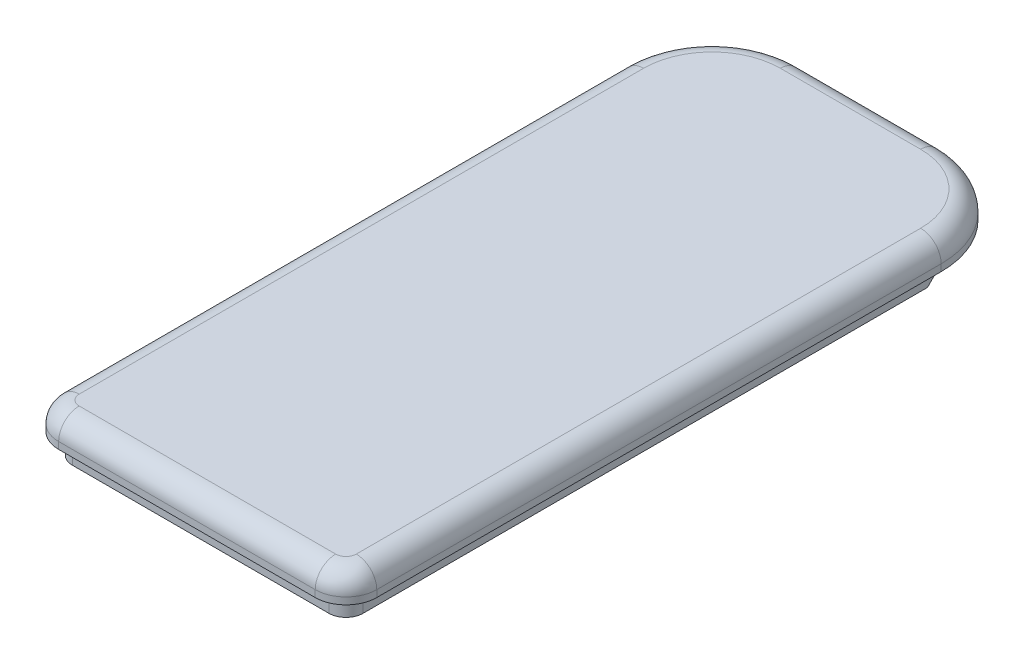
ISO-10303-21;
HEADER;
FILE_DESCRIPTION(('STEP AP214'),'2;1');
FILE_NAME('part.step','',(''),(''),'','','');
FILE_SCHEMA(('AUTOMOTIVE_DESIGN { 1 0 10303 214 1 1 1 1 }'));
ENDSEC;
DATA;
#1=APPLICATION_CONTEXT('core data for automotive mechanical design processes');
#2=APPLICATION_PROTOCOL_DEFINITION('international standard','automotive_design',2000,#1);
#3=PRODUCT_CONTEXT('',#1,'mechanical');
#4=PRODUCT('Part','Part','',(#3));
#5=PRODUCT_RELATED_PRODUCT_CATEGORY('part','',(#4));
#6=PRODUCT_DEFINITION_FORMATION('','',#4);
#7=PRODUCT_DEFINITION_CONTEXT('part definition',#1,'design');
#8=PRODUCT_DEFINITION('design','',#6,#7);
#9=PRODUCT_DEFINITION_SHAPE('','',#8);
#10=(LENGTH_UNIT() NAMED_UNIT(*) SI_UNIT(.MILLI.,.METRE.));
#11=(NAMED_UNIT(*) PLANE_ANGLE_UNIT() SI_UNIT($,.RADIAN.));
#12=(NAMED_UNIT(*) SI_UNIT($,.STERADIAN.) SOLID_ANGLE_UNIT());
#13=UNCERTAINTY_MEASURE_WITH_UNIT(LENGTH_MEASURE(1.E-05),#10,'distance_accuracy_value','');
#14=(GEOMETRIC_REPRESENTATION_CONTEXT(3) GLOBAL_UNCERTAINTY_ASSIGNED_CONTEXT((#13)) GLOBAL_UNIT_ASSIGNED_CONTEXT((#10,
#11,#12)) REPRESENTATION_CONTEXT('',''));
#15=CARTESIAN_POINT('',(0.,0.,0.));
#16=DIRECTION('',(0.,0.,1.));
#17=DIRECTION('',(1.,0.,0.));
#18=AXIS2_PLACEMENT_3D('',#15,#16,#17);
#19=CARTESIAN_POINT('',(4.5,-4.,-4.5));
#20=DIRECTION('',(0.,1.,0.));
#21=DIRECTION('',(0.,0.,1.));
#22=AXIS2_PLACEMENT_3D('',#19,#20,#21);
#23=PLANE('',#22);
#24=CARTESIAN_POINT('',(4.5,-4.,-4.5));
#25=DIRECTION('',(0.,1.,0.));
#26=DIRECTION('',(0.,0.,1.));
#27=AXIS2_PLACEMENT_3D('',#24,#25,#26);
#28=CIRCLE('',#27,4.5);
#29=CARTESIAN_POINT('',(0.,-4.,-4.50000000000003));
#30=VERTEX_POINT('',#29);
#31=CARTESIAN_POINT('',(4.50000000000003,-4.,0.));
#32=VERTEX_POINT('',#31);
#33=EDGE_CURVE('E321',#30,#32,#28,.T.);
#34=ORIENTED_EDGE('',*,*,#33,.F.);
#35=DIRECTION('',(0.,0.,1.));
#36=VECTOR('',#35,1.);
#37=CARTESIAN_POINT('',(0.,-4.,-4.50000000000003));
#38=LINE('',#37,#36);
#39=CARTESIAN_POINT('',(0.,-4.,-86.9999999999999));
#40=VERTEX_POINT('',#39);
#41=EDGE_CURVE('E354',#40,#30,#38,.T.);
#42=ORIENTED_EDGE('',*,*,#41,.F.);
#43=CARTESIAN_POINT('',(13.,-4.,-87.));
#44=DIRECTION('',(0.,1.,0.));
#45=DIRECTION('',(0.,0.,-1.));
#46=AXIS2_PLACEMENT_3D('',#43,#44,#45);
#47=CIRCLE('',#46,13.);
#48=CARTESIAN_POINT('',(13.0000000000001,-4.,-100.));
#49=VERTEX_POINT('',#48);
#50=EDGE_CURVE('E351',#49,#40,#47,.T.);
#51=ORIENTED_EDGE('',*,*,#50,.F.);
#52=DIRECTION('',(-1.,0.,0.));
#53=VECTOR('',#52,1.);
#54=CARTESIAN_POINT('',(13.0000000000001,-4.,-100.));
#55=LINE('',#54,#53);
#56=CARTESIAN_POINT('',(33.4999999999999,-4.,-100.));
#57=VERTEX_POINT('',#56);
#58=EDGE_CURVE('E348',#57,#49,#55,.T.);
#59=ORIENTED_EDGE('',*,*,#58,.F.);
#60=CARTESIAN_POINT('',(33.5,-4.,-87.));
#61=DIRECTION('',(0.,1.,0.));
#62=DIRECTION('',(0.,0.,-1.));
#63=AXIS2_PLACEMENT_3D('',#60,#61,#62);
#64=CIRCLE('',#63,13.);
#65=CARTESIAN_POINT('',(46.5,-4.,-86.9999999999999));
#66=VERTEX_POINT('',#65);
#67=EDGE_CURVE('E345',#66,#57,#64,.T.);
#68=ORIENTED_EDGE('',*,*,#67,.F.);
#69=DIRECTION('',(0.,0.,-1.));
#70=VECTOR('',#69,1.);
#71=CARTESIAN_POINT('',(46.5,-4.,-4.50000000000003));
#72=LINE('',#71,#70);
#73=CARTESIAN_POINT('',(46.5,-4.,-4.50000000000003));
#74=VERTEX_POINT('',#73);
#75=EDGE_CURVE('E342',#74,#66,#72,.T.);
#76=ORIENTED_EDGE('',*,*,#75,.F.);
#77=CARTESIAN_POINT('',(42.,-4.,-4.5));
#78=DIRECTION('',(0.,1.,0.));
#79=DIRECTION('',(0.,0.,-1.));
#80=AXIS2_PLACEMENT_3D('',#77,#78,#79);
#81=CIRCLE('',#80,4.5);
#82=CARTESIAN_POINT('',(42.,-4.,0.));
#83=VERTEX_POINT('',#82);
#84=EDGE_CURVE('E339',#83,#74,#81,.T.);
#85=ORIENTED_EDGE('',*,*,#84,.F.);
#86=DIRECTION('',(1.,0.,0.));
#87=VECTOR('',#86,1.);
#88=CARTESIAN_POINT('',(4.50000000000003,-4.,0.));
#89=LINE('',#88,#87);
#90=EDGE_CURVE('E336',#32,#83,#89,.T.);
#91=ORIENTED_EDGE('',*,*,#90,.F.);
#92=EDGE_LOOP('',(#34,#42,#51,#59,#68,#76,#85,#91));
#93=FACE_BOUND('',#92,.T.);
#94=CARTESIAN_POINT('',(13.,-4.,-87.));
#95=DIRECTION('',(0.,-1.,0.));
#96=DIRECTION('',(0.,0.,-1.));
#97=AXIS2_PLACEMENT_3D('',#94,#95,#96);
#98=CIRCLE('',#97,9.5);
#99=CARTESIAN_POINT('',(3.98612181133999,-4.,-89.9999999999999));
#100=VERTEX_POINT('',#99);
#101=CARTESIAN_POINT('',(13.0000000000001,-4.,-96.5));
#102=VERTEX_POINT('',#101);
#103=EDGE_CURVE('E292',#100,#102,#98,.T.);
#104=ORIENTED_EDGE('',*,*,#103,.F.);
#105=DIRECTION('',(-1.,0.,0.));
#106=VECTOR('',#105,1.);
#107=CARTESIAN_POINT('',(2.,-4.,-89.9999999999999));
#108=LINE('',#107,#106);
#109=CARTESIAN_POINT('',(2.,-4.,-89.9999999999999));
#110=VERTEX_POINT('',#109);
#111=EDGE_CURVE('E380',#100,#110,#108,.T.);
#112=ORIENTED_EDGE('',*,*,#111,.T.);
#113=DIRECTION('',(0.,0.,-1.));
#114=VECTOR('',#113,1.);
#115=CARTESIAN_POINT('',(2.,-4.,-86.9999999999999));
#116=LINE('',#115,#114);
#117=CARTESIAN_POINT('',(2.,-4.,-4.50000000000003));
#118=VERTEX_POINT('',#117);
#119=EDGE_CURVE('E279',#118,#110,#116,.T.);
#120=ORIENTED_EDGE('',*,*,#119,.F.);
#121=CARTESIAN_POINT('',(4.5,-4.,-4.5));
#122=DIRECTION('',(0.,-1.,0.));
#123=DIRECTION('',(0.,0.,-1.));
#124=AXIS2_PLACEMENT_3D('',#121,#122,#123);
#125=CIRCLE('',#124,2.5);
#126=CARTESIAN_POINT('',(4.50000000000002,-4.,-2.));
#127=VERTEX_POINT('',#126);
#128=EDGE_CURVE('E276',#127,#118,#125,.T.);
#129=ORIENTED_EDGE('',*,*,#128,.F.);
#130=DIRECTION('',(-1.,0.,0.));
#131=VECTOR('',#130,1.);
#132=CARTESIAN_POINT('',(4.50000000000002,-4.,-2.));
#133=LINE('',#132,#131);
#134=CARTESIAN_POINT('',(42.,-4.,-2.));
#135=VERTEX_POINT('',#134);
#136=EDGE_CURVE('E273',#135,#127,#133,.T.);
#137=ORIENTED_EDGE('',*,*,#136,.F.);
#138=CARTESIAN_POINT('',(42.,-4.,-4.5));
#139=DIRECTION('',(0.,-1.,0.));
#140=DIRECTION('',(0.,0.,-1.));
#141=AXIS2_PLACEMENT_3D('',#138,#139,#140);
#142=CIRCLE('',#141,2.5);
#143=CARTESIAN_POINT('',(44.5,-4.,-4.50000000000002));
#144=VERTEX_POINT('',#143);
#145=EDGE_CURVE('E270',#144,#135,#142,.T.);
#146=ORIENTED_EDGE('',*,*,#145,.F.);
#147=DIRECTION('',(0.,0.,1.));
#148=VECTOR('',#147,1.);
#149=CARTESIAN_POINT('',(44.5,-4.,-4.50000000000002));
#150=LINE('',#149,#148);
#151=CARTESIAN_POINT('',(44.5,-4.,-89.9999999999999));
#152=VERTEX_POINT('',#151);
#153=EDGE_CURVE('E267',#152,#144,#150,.T.);
#154=ORIENTED_EDGE('',*,*,#153,.F.);
#155=DIRECTION('',(-1.,0.,0.));
#156=VECTOR('',#155,1.);
#157=CARTESIAN_POINT('',(43.,-4.,-89.9999999999999));
#158=LINE('',#157,#156);
#159=CARTESIAN_POINT('',(42.51387818866,-4.,-89.9999999999999));
#160=VERTEX_POINT('',#159);
#161=EDGE_CURVE('E361',#152,#160,#158,.T.);
#162=ORIENTED_EDGE('',*,*,#161,.T.);
#163=CARTESIAN_POINT('',(33.5,-4.,-87.));
#164=DIRECTION('',(0.,-1.,0.));
#165=DIRECTION('',(0.,0.,-1.));
#166=AXIS2_PLACEMENT_3D('',#163,#164,#165);
#167=CIRCLE('',#166,9.49999999999999);
#168=CARTESIAN_POINT('',(33.4999999999999,-4.,-96.5));
#169=VERTEX_POINT('',#168);
#170=EDGE_CURVE('E295',#169,#160,#167,.T.);
#171=ORIENTED_EDGE('',*,*,#170,.F.);
#172=DIRECTION('',(1.,0.,0.));
#173=VECTOR('',#172,1.);
#174=CARTESIAN_POINT('',(13.0000000000001,-4.,-96.5));
#175=LINE('',#174,#173);
#176=EDGE_CURVE('E315',#102,#169,#175,.T.);
#177=ORIENTED_EDGE('',*,*,#176,.F.);
#178=EDGE_LOOP('',(#104,#112,#120,#129,#137,#146,#154,#162,#171,#177));
#179=FACE_BOUND('',#178,.T.);
#180=ADVANCED_FACE('F36',(#93,#179),#23,.F.);
#181=CARTESIAN_POINT('',(4.5,-4.,-4.5));
#182=DIRECTION('',(0.,1.,0.));
#183=DIRECTION('',(0.,0.,1.));
#184=AXIS2_PLACEMENT_3D('',#181,#182,#183);
#185=CYLINDRICAL_SURFACE('',#184,4.5);
#186=DIRECTION('',(0.,1.,0.));
#187=VECTOR('',#186,1.);
#188=CARTESIAN_POINT('',(4.50000000000003,-4.,0.));
#189=LINE('',#188,#187);
#190=CARTESIAN_POINT('',(4.50000000000003,-3.,0.));
#191=VERTEX_POINT('',#190);
#192=EDGE_CURVE('E357',#32,#191,#189,.T.);
#193=ORIENTED_EDGE('',*,*,#192,.T.);
#194=CARTESIAN_POINT('',(4.5,-3.,-4.5));
#195=DIRECTION('',(0.,1.,0.));
#196=DIRECTION('',(0.,0.,1.));
#197=AXIS2_PLACEMENT_3D('',#194,#195,#196);
#198=CIRCLE('',#197,4.5);
#199=CARTESIAN_POINT('',(0.,-3.,-4.50000000000003));
#200=VERTEX_POINT('',#199);
#201=EDGE_CURVE('E410',#191,#200,#198,.F.);
#202=ORIENTED_EDGE('',*,*,#201,.T.);
#203=DIRECTION('',(0.,1.,0.));
#204=VECTOR('',#203,1.);
#205=CARTESIAN_POINT('',(0.,-4.,-4.50000000000003));
#206=LINE('',#205,#204);
#207=EDGE_CURVE('E358',#30,#200,#206,.T.);
#208=ORIENTED_EDGE('',*,*,#207,.F.);
#209=ORIENTED_EDGE('',*,*,#33,.T.);
#210=EDGE_LOOP('',(#193,#202,#208,#209));
#211=FACE_BOUND('',#210,.T.);
#212=ADVANCED_FACE('F484',(#211),#185,.T.);
#213=CARTESIAN_POINT('',(0.,-4.,-4.50000000000003));
#214=DIRECTION('',(-1.,0.,0.));
#215=DIRECTION('',(0.,0.,1.));
#216=AXIS2_PLACEMENT_3D('',#213,#214,#215);
#217=PLANE('',#216);
#218=ORIENTED_EDGE('',*,*,#207,.T.);
#219=DIRECTION('',(0.,0.,1.));
#220=VECTOR('',#219,1.);
#221=CARTESIAN_POINT('',(0.,-3.,-4.50000000000003));
#222=LINE('',#221,#220);
#223=CARTESIAN_POINT('',(0.,-3.,-86.9999999999999));
#224=VERTEX_POINT('',#223);
#225=EDGE_CURVE('E413',#200,#224,#222,.F.);
#226=ORIENTED_EDGE('',*,*,#225,.T.);
#227=DIRECTION('',(0.,1.,0.));
#228=VECTOR('',#227,1.);
#229=CARTESIAN_POINT('',(0.,-4.,-86.9999999999999));
#230=LINE('',#229,#228);
#231=EDGE_CURVE('E362',#40,#224,#230,.T.);
#232=ORIENTED_EDGE('',*,*,#231,.F.);
#233=ORIENTED_EDGE('',*,*,#41,.T.);
#234=EDGE_LOOP('',(#218,#226,#232,#233));
#235=FACE_BOUND('',#234,.T.);
#236=ADVANCED_FACE('F486',(#235),#217,.T.);
#237=CARTESIAN_POINT('',(13.,-4.,-87.));
#238=DIRECTION('',(0.,1.,0.));
#239=DIRECTION('',(0.,0.,1.));
#240=AXIS2_PLACEMENT_3D('',#237,#238,#239);
#241=CYLINDRICAL_SURFACE('',#240,13.);
#242=ORIENTED_EDGE('',*,*,#231,.T.);
#243=CARTESIAN_POINT('',(13.,-3.,-87.));
#244=DIRECTION('',(0.,1.,0.));
#245=DIRECTION('',(0.,0.,1.));
#246=AXIS2_PLACEMENT_3D('',#243,#244,#245);
#247=CIRCLE('',#246,13.);
#248=CARTESIAN_POINT('',(13.0000000000001,-3.,-100.));
#249=VERTEX_POINT('',#248);
#250=EDGE_CURVE('E415',#224,#249,#247,.F.);
#251=ORIENTED_EDGE('',*,*,#250,.T.);
#252=DIRECTION('',(0.,1.,0.));
#253=VECTOR('',#252,1.);
#254=CARTESIAN_POINT('',(13.0000000000001,-4.,-100.));
#255=LINE('',#254,#253);
#256=EDGE_CURVE('E365',#49,#249,#255,.T.);
#257=ORIENTED_EDGE('',*,*,#256,.F.);
#258=ORIENTED_EDGE('',*,*,#50,.T.);
#259=EDGE_LOOP('',(#242,#251,#257,#258));
#260=FACE_BOUND('',#259,.T.);
#261=ADVANCED_FACE('F492',(#260),#241,.T.);
#262=CARTESIAN_POINT('',(13.0000000000001,-4.,-100.));
#263=DIRECTION('',(0.,0.,-1.));
#264=DIRECTION('',(-1.,0.,0.));
#265=AXIS2_PLACEMENT_3D('',#262,#263,#264);
#266=PLANE('',#265);
#267=ORIENTED_EDGE('',*,*,#256,.T.);
#268=DIRECTION('',(-1.,0.,0.));
#269=VECTOR('',#268,1.);
#270=CARTESIAN_POINT('',(13.0000000000001,-3.,-100.));
#271=LINE('',#270,#269);
#272=CARTESIAN_POINT('',(33.4999999999999,-3.,-100.));
#273=VERTEX_POINT('',#272);
#274=EDGE_CURVE('E417',#249,#273,#271,.F.);
#275=ORIENTED_EDGE('',*,*,#274,.T.);
#276=DIRECTION('',(0.,1.,0.));
#277=VECTOR('',#276,1.);
#278=CARTESIAN_POINT('',(33.4999999999999,-4.,-100.));
#279=LINE('',#278,#277);
#280=EDGE_CURVE('E368',#57,#273,#279,.T.);
#281=ORIENTED_EDGE('',*,*,#280,.F.);
#282=ORIENTED_EDGE('',*,*,#58,.T.);
#283=EDGE_LOOP('',(#267,#275,#281,#282));
#284=FACE_BOUND('',#283,.T.);
#285=ADVANCED_FACE('F491',(#284),#266,.T.);
#286=CARTESIAN_POINT('',(33.5,-4.,-87.));
#287=DIRECTION('',(0.,1.,0.));
#288=DIRECTION('',(0.,0.,1.));
#289=AXIS2_PLACEMENT_3D('',#286,#287,#288);
#290=CYLINDRICAL_SURFACE('',#289,13.);
#291=ORIENTED_EDGE('',*,*,#280,.T.);
#292=CARTESIAN_POINT('',(33.5,-3.,-87.));
#293=DIRECTION('',(0.,1.,0.));
#294=DIRECTION('',(0.,0.,1.));
#295=AXIS2_PLACEMENT_3D('',#292,#293,#294);
#296=CIRCLE('',#295,13.);
#297=CARTESIAN_POINT('',(46.5,-3.,-86.9999999999999));
#298=VERTEX_POINT('',#297);
#299=EDGE_CURVE('E419',#273,#298,#296,.F.);
#300=ORIENTED_EDGE('',*,*,#299,.T.);
#301=DIRECTION('',(0.,1.,0.));
#302=VECTOR('',#301,1.);
#303=CARTESIAN_POINT('',(46.5,-4.,-86.9999999999999));
#304=LINE('',#303,#302);
#305=EDGE_CURVE('E371',#66,#298,#304,.T.);
#306=ORIENTED_EDGE('',*,*,#305,.F.);
#307=ORIENTED_EDGE('',*,*,#67,.T.);
#308=EDGE_LOOP('',(#291,#300,#306,#307));
#309=FACE_BOUND('',#308,.T.);
#310=ADVANCED_FACE('F454',(#309),#290,.T.);
#311=CARTESIAN_POINT('',(46.5,-4.,-4.50000000000003));
#312=DIRECTION('',(1.,0.,0.));
#313=DIRECTION('',(0.,0.,-1.));
#314=AXIS2_PLACEMENT_3D('',#311,#312,#313);
#315=PLANE('',#314);
#316=ORIENTED_EDGE('',*,*,#305,.T.);
#317=DIRECTION('',(0.,0.,-1.));
#318=VECTOR('',#317,1.);
#319=CARTESIAN_POINT('',(46.5,-3.,-4.50000000000003));
#320=LINE('',#319,#318);
#321=CARTESIAN_POINT('',(46.5,-3.,-4.50000000000003));
#322=VERTEX_POINT('',#321);
#323=EDGE_CURVE('E60',#298,#322,#320,.F.);
#324=ORIENTED_EDGE('',*,*,#323,.T.);
#325=DIRECTION('',(0.,1.,0.));
#326=VECTOR('',#325,1.);
#327=CARTESIAN_POINT('',(46.5,-4.,-4.50000000000003));
#328=LINE('',#327,#326);
#329=EDGE_CURVE('E373',#74,#322,#328,.T.);
#330=ORIENTED_EDGE('',*,*,#329,.F.);
#331=ORIENTED_EDGE('',*,*,#75,.T.);
#332=EDGE_LOOP('',(#316,#324,#330,#331));
#333=FACE_BOUND('',#332,.T.);
#334=ADVANCED_FACE('F456',(#333),#315,.T.);
#335=CARTESIAN_POINT('',(42.,-4.,-4.5));
#336=DIRECTION('',(0.,1.,0.));
#337=DIRECTION('',(0.,0.,1.));
#338=AXIS2_PLACEMENT_3D('',#335,#336,#337);
#339=CYLINDRICAL_SURFACE('',#338,4.5);
#340=ORIENTED_EDGE('',*,*,#329,.T.);
#341=CARTESIAN_POINT('',(42.,-3.,-4.5));
#342=DIRECTION('',(0.,1.,0.));
#343=DIRECTION('',(0.,0.,1.));
#344=AXIS2_PLACEMENT_3D('',#341,#342,#343);
#345=CIRCLE('',#344,4.5);
#346=CARTESIAN_POINT('',(42.,-3.,0.));
#347=VERTEX_POINT('',#346);
#348=EDGE_CURVE('E45',#322,#347,#345,.F.);
#349=ORIENTED_EDGE('',*,*,#348,.T.);
#350=DIRECTION('',(0.,1.,0.));
#351=VECTOR('',#350,1.);
#352=CARTESIAN_POINT('',(42.,-4.,0.));
#353=LINE('',#352,#351);
#354=EDGE_CURVE('E375',#83,#347,#353,.T.);
#355=ORIENTED_EDGE('',*,*,#354,.F.);
#356=ORIENTED_EDGE('',*,*,#84,.T.);
#357=EDGE_LOOP('',(#340,#349,#355,#356));
#358=FACE_BOUND('',#357,.T.);
#359=ADVANCED_FACE('F464',(#358),#339,.T.);
#360=CARTESIAN_POINT('',(4.50000000000003,-4.,0.));
#361=DIRECTION('',(0.,0.,1.));
#362=DIRECTION('',(1.,0.,0.));
#363=AXIS2_PLACEMENT_3D('',#360,#361,#362);
#364=PLANE('',#363);
#365=ORIENTED_EDGE('',*,*,#354,.T.);
#366=DIRECTION('',(1.,0.,0.));
#367=VECTOR('',#366,1.);
#368=CARTESIAN_POINT('',(4.50000000000003,-3.,0.));
#369=LINE('',#368,#367);
#370=EDGE_CURVE('E11',#347,#191,#369,.F.);
#371=ORIENTED_EDGE('',*,*,#370,.T.);
#372=ORIENTED_EDGE('',*,*,#192,.F.);
#373=ORIENTED_EDGE('',*,*,#90,.T.);
#374=EDGE_LOOP('',(#365,#371,#372,#373));
#375=FACE_BOUND('',#374,.T.);
#376=ADVANCED_FACE('F468',(#375),#364,.T.);
#377=CARTESIAN_POINT('',(4.5,0.,-4.5));
#378=DIRECTION('',(0.,1.,0.));
#379=DIRECTION('',(0.,0.,1.));
#380=AXIS2_PLACEMENT_3D('',#377,#378,#379);
#381=PLANE('',#380);
#382=DIRECTION('',(0.,0.,1.));
#383=VECTOR('',#382,1.);
#384=CARTESIAN_POINT('',(3.,0.,-4.5));
#385=LINE('',#384,#383);
#386=CARTESIAN_POINT('',(3.,0.,-86.9999999999999));
#387=VERTEX_POINT('',#386);
#388=CARTESIAN_POINT('',(3.,0.,-4.50000000000001));
#389=VERTEX_POINT('',#388);
#390=EDGE_CURVE('E405',#387,#389,#385,.T.);
#391=ORIENTED_EDGE('',*,*,#390,.T.);
#392=CARTESIAN_POINT('',(4.5,0.,-4.5));
#393=DIRECTION('',(0.,1.,0.));
#394=DIRECTION('',(0.,0.,1.));
#395=AXIS2_PLACEMENT_3D('',#392,#393,#394);
#396=CIRCLE('',#395,1.5);
#397=CARTESIAN_POINT('',(4.50000000000001,0.,-3.));
#398=VERTEX_POINT('',#397);
#399=EDGE_CURVE('E407',#389,#398,#396,.T.);
#400=ORIENTED_EDGE('',*,*,#399,.T.);
#401=DIRECTION('',(1.,0.,0.));
#402=VECTOR('',#401,1.);
#403=CARTESIAN_POINT('',(4.5,0.,-3.));
#404=LINE('',#403,#402);
#405=CARTESIAN_POINT('',(42.,0.,-3.));
#406=VERTEX_POINT('',#405);
#407=EDGE_CURVE('E393',#398,#406,#404,.T.);
#408=ORIENTED_EDGE('',*,*,#407,.T.);
#409=CARTESIAN_POINT('',(42.,0.,-4.5));
#410=DIRECTION('',(0.,1.,0.));
#411=DIRECTION('',(0.,0.,1.));
#412=AXIS2_PLACEMENT_3D('',#409,#410,#411);
#413=CIRCLE('',#412,1.5);
#414=CARTESIAN_POINT('',(43.5,0.,-4.50000000000003));
#415=VERTEX_POINT('',#414);
#416=EDGE_CURVE('E395',#406,#415,#413,.T.);
#417=ORIENTED_EDGE('',*,*,#416,.T.);
#418=DIRECTION('',(0.,0.,-1.));
#419=VECTOR('',#418,1.);
#420=CARTESIAN_POINT('',(43.5,0.,-4.5));
#421=LINE('',#420,#419);
#422=CARTESIAN_POINT('',(43.5,0.,-86.9999999999999));
#423=VERTEX_POINT('',#422);
#424=EDGE_CURVE('E397',#415,#423,#421,.T.);
#425=ORIENTED_EDGE('',*,*,#424,.T.);
#426=CARTESIAN_POINT('',(33.5,0.,-87.));
#427=DIRECTION('',(0.,1.,0.));
#428=DIRECTION('',(0.,0.,1.));
#429=AXIS2_PLACEMENT_3D('',#426,#427,#428);
#430=CIRCLE('',#429,10.);
#431=CARTESIAN_POINT('',(33.4999999999999,0.,-97.));
#432=VERTEX_POINT('',#431);
#433=EDGE_CURVE('E399',#423,#432,#430,.T.);
#434=ORIENTED_EDGE('',*,*,#433,.T.);
#435=DIRECTION('',(-1.,0.,0.));
#436=VECTOR('',#435,1.);
#437=CARTESIAN_POINT('',(4.5,0.,-97.));
#438=LINE('',#437,#436);
#439=CARTESIAN_POINT('',(13.0000000000001,0.,-97.));
#440=VERTEX_POINT('',#439);
#441=EDGE_CURVE('E401',#432,#440,#438,.T.);
#442=ORIENTED_EDGE('',*,*,#441,.T.);
#443=CARTESIAN_POINT('',(13.,0.,-87.));
#444=DIRECTION('',(0.,1.,0.));
#445=DIRECTION('',(0.,0.,1.));
#446=AXIS2_PLACEMENT_3D('',#443,#444,#445);
#447=CIRCLE('',#446,10.);
#448=EDGE_CURVE('E403',#440,#387,#447,.T.);
#449=ORIENTED_EDGE('',*,*,#448,.T.);
#450=EDGE_LOOP('',(#391,#400,#408,#417,#425,#434,#442,#449));
#451=FACE_BOUND('',#450,.T.);
#452=ADVANCED_FACE('F502',(#451),#381,.T.);
#453=CARTESIAN_POINT('',(4.5,-2.5,-4.5));
#454=DIRECTION('',(0.,-1.,0.));
#455=DIRECTION('',(0.,0.,-1.));
#456=AXIS2_PLACEMENT_3D('',#453,#454,#455);
#457=CYLINDRICAL_SURFACE('',#456,1.);
#458=DIRECTION('',(0.,-1.,0.));
#459=VECTOR('',#458,1.);
#460=CARTESIAN_POINT('',(4.50000000000003,-2.5,-3.5));
#461=LINE('',#460,#459);
#462=CARTESIAN_POINT('',(4.50000000000003,-2.5,-3.5));
#463=VERTEX_POINT('',#462);
#464=CARTESIAN_POINT('',(4.50000000000001,-7.,-3.5));
#465=VERTEX_POINT('',#464);
#466=EDGE_CURVE('E241',#463,#465,#461,.T.);
#467=ORIENTED_EDGE('',*,*,#466,.T.);
#468=CARTESIAN_POINT('',(4.5,-7.,-4.5));
#469=DIRECTION('',(0.,1.,0.));
#470=DIRECTION('',(0.,0.,-1.));
#471=AXIS2_PLACEMENT_3D('',#468,#469,#470);
#472=CIRCLE('',#471,1.00000000000001);
#473=CARTESIAN_POINT('',(3.49999999999999,-7.,-4.50000000000003));
#474=VERTEX_POINT('',#473);
#475=EDGE_CURVE('E234',#474,#465,#472,.T.);
#476=ORIENTED_EDGE('',*,*,#475,.F.);
#477=DIRECTION('',(0.,-1.,0.));
#478=VECTOR('',#477,1.);
#479=CARTESIAN_POINT('',(3.5,-2.5,-4.50000000000003));
#480=LINE('',#479,#478);
#481=CARTESIAN_POINT('',(3.5,-2.5,-4.50000000000003));
#482=VERTEX_POINT('',#481);
#483=EDGE_CURVE('E216',#482,#474,#480,.T.);
#484=ORIENTED_EDGE('',*,*,#483,.F.);
#485=CARTESIAN_POINT('',(4.5,-2.5,-4.5));
#486=DIRECTION('',(0.,-1.,0.));
#487=DIRECTION('',(0.,0.,-1.));
#488=AXIS2_PLACEMENT_3D('',#485,#486,#487);
#489=CIRCLE('',#488,1.);
#490=EDGE_CURVE('E293',#463,#482,#489,.T.);
#491=ORIENTED_EDGE('',*,*,#490,.F.);
#492=EDGE_LOOP('',(#467,#476,#484,#491));
#493=FACE_BOUND('',#492,.T.);
#494=ADVANCED_FACE('F240',(#493),#457,.F.);
#495=CARTESIAN_POINT('',(42.,-2.5,-3.5));
#496=DIRECTION('',(0.,0.,1.));
#497=DIRECTION('',(1.,0.,0.));
#498=AXIS2_PLACEMENT_3D('',#495,#496,#497);
#499=PLANE('',#498);
#500=DIRECTION('',(0.,-1.,0.));
#501=VECTOR('',#500,1.);
#502=CARTESIAN_POINT('',(42.,-2.5,-3.5));
#503=LINE('',#502,#501);
#504=CARTESIAN_POINT('',(42.,-2.5,-3.5));
#505=VERTEX_POINT('',#504);
#506=CARTESIAN_POINT('',(42.,-7.,-3.5));
#507=VERTEX_POINT('',#506);
#508=EDGE_CURVE('E322',#505,#507,#503,.T.);
#509=ORIENTED_EDGE('',*,*,#508,.T.);
#510=DIRECTION('',(1.,0.,0.));
#511=VECTOR('',#510,1.);
#512=CARTESIAN_POINT('',(4.50000000000001,-7.,-3.5));
#513=LINE('',#512,#511);
#514=EDGE_CURVE('E242',#465,#507,#513,.T.);
#515=ORIENTED_EDGE('',*,*,#514,.F.);
#516=ORIENTED_EDGE('',*,*,#466,.F.);
#517=DIRECTION('',(-1.,0.,0.));
#518=VECTOR('',#517,1.);
#519=CARTESIAN_POINT('',(42.,-2.5,-3.5));
#520=LINE('',#519,#518);
#521=EDGE_CURVE('E228',#505,#463,#520,.T.);
#522=ORIENTED_EDGE('',*,*,#521,.F.);
#523=EDGE_LOOP('',(#509,#515,#516,#522));
#524=FACE_BOUND('',#523,.T.);
#525=ADVANCED_FACE('F696',(#524),#499,.F.);
#526=CARTESIAN_POINT('',(42.,-2.5,-4.5));
#527=DIRECTION('',(0.,-1.,0.));
#528=DIRECTION('',(0.,0.,-1.));
#529=AXIS2_PLACEMENT_3D('',#526,#527,#528);
#530=CYLINDRICAL_SURFACE('',#529,0.999999999999996);
#531=DIRECTION('',(0.,-1.,0.));
#532=VECTOR('',#531,1.);
#533=CARTESIAN_POINT('',(43.,-2.5,-4.50000000000003));
#534=LINE('',#533,#532);
#535=CARTESIAN_POINT('',(43.,-2.5,-4.50000000000003));
#536=VERTEX_POINT('',#535);
#537=CARTESIAN_POINT('',(43.,-7.,-4.50000000000001));
#538=VERTEX_POINT('',#537);
#539=EDGE_CURVE('E324',#536,#538,#534,.T.);
#540=ORIENTED_EDGE('',*,*,#539,.T.);
#541=CARTESIAN_POINT('',(42.,-7.,-4.5));
#542=DIRECTION('',(0.,1.,0.));
#543=DIRECTION('',(0.,0.,-1.));
#544=AXIS2_PLACEMENT_3D('',#541,#542,#543);
#545=CIRCLE('',#544,1.);
#546=EDGE_CURVE('E244',#507,#538,#545,.T.);
#547=ORIENTED_EDGE('',*,*,#546,.F.);
#548=ORIENTED_EDGE('',*,*,#508,.F.);
#549=CARTESIAN_POINT('',(42.,-2.5,-4.5));
#550=DIRECTION('',(0.,-1.,0.));
#551=DIRECTION('',(0.,0.,-1.));
#552=AXIS2_PLACEMENT_3D('',#549,#550,#551);
#553=CIRCLE('',#552,0.999999999999996);
#554=EDGE_CURVE('E309',#536,#505,#553,.T.);
#555=ORIENTED_EDGE('',*,*,#554,.F.);
#556=EDGE_LOOP('',(#540,#547,#548,#555));
#557=FACE_BOUND('',#556,.T.);
#558=ADVANCED_FACE('F683',(#557),#530,.F.);
#559=CARTESIAN_POINT('',(43.,-2.5,-86.9999999999999));
#560=DIRECTION('',(1.,0.,0.));
#561=DIRECTION('',(0.,0.,-1.));
#562=AXIS2_PLACEMENT_3D('',#559,#560,#561);
#563=PLANE('',#562);
#564=DIRECTION('',(0.,-1.,0.));
#565=VECTOR('',#564,1.);
#566=CARTESIAN_POINT('',(43.,-2.5,-86.9999999999999));
#567=LINE('',#566,#565);
#568=CARTESIAN_POINT('',(43.,-2.5,-86.9999999999999));
#569=VERTEX_POINT('',#568);
#570=CARTESIAN_POINT('',(43.,-7.,-86.9999999999999));
#571=VERTEX_POINT('',#570);
#572=EDGE_CURVE('E326',#569,#571,#567,.T.);
#573=ORIENTED_EDGE('',*,*,#572,.T.);
#574=DIRECTION('',(0.,0.,-1.));
#575=VECTOR('',#574,1.);
#576=CARTESIAN_POINT('',(43.,-7.,-4.50000000000001));
#577=LINE('',#576,#575);
#578=EDGE_CURVE('E250',#538,#571,#577,.T.);
#579=ORIENTED_EDGE('',*,*,#578,.F.);
#580=ORIENTED_EDGE('',*,*,#539,.F.);
#581=DIRECTION('',(0.,0.,1.));
#582=VECTOR('',#581,1.);
#583=CARTESIAN_POINT('',(43.,-2.5,-86.9999999999999));
#584=LINE('',#583,#582);
#585=EDGE_CURVE('E306',#569,#536,#584,.T.);
#586=ORIENTED_EDGE('',*,*,#585,.F.);
#587=EDGE_LOOP('',(#573,#579,#580,#586));
#588=FACE_BOUND('',#587,.T.);
#589=ADVANCED_FACE('F675',(#588),#563,.F.);
#590=CARTESIAN_POINT('',(33.5,-2.5,-87.));
#591=DIRECTION('',(0.,-1.,0.));
#592=DIRECTION('',(0.,0.,-1.));
#593=AXIS2_PLACEMENT_3D('',#590,#591,#592);
#594=CYLINDRICAL_SURFACE('',#593,9.49999999999999);
#595=ORIENTED_EDGE('',*,*,#170,.T.);
#596=CARTESIAN_POINT('',(33.5,-6.99999999999991,-87.));
#597=DIRECTION('',(0.,-0.707106781186544,-0.707106781186551));
#598=DIRECTION('',(0.,-0.707106781186551,0.707106781186544));
#599=AXIS2_PLACEMENT_3D('',#596,#597,#598);
#600=ELLIPSE('',#599,13.4350288425445,9.49999999999999);
#601=EDGE_CURVE('E390',#160,#571,#600,.T.);
#602=ORIENTED_EDGE('',*,*,#601,.T.);
#603=ORIENTED_EDGE('',*,*,#572,.F.);
#604=CARTESIAN_POINT('',(33.5,-2.5,-87.));
#605=DIRECTION('',(0.,-1.,0.));
#606=DIRECTION('',(0.,0.,-1.));
#607=AXIS2_PLACEMENT_3D('',#604,#605,#606);
#608=CIRCLE('',#607,9.49999999999999);
#609=CARTESIAN_POINT('',(33.4999999999999,-2.5,-96.5));
#610=VERTEX_POINT('',#609);
#611=EDGE_CURVE('E303',#610,#569,#608,.T.);
#612=ORIENTED_EDGE('',*,*,#611,.F.);
#613=DIRECTION('',(0.,-1.,0.));
#614=VECTOR('',#613,1.);
#615=CARTESIAN_POINT('',(33.4999999999999,-2.5,-96.5));
#616=LINE('',#615,#614);
#617=EDGE_CURVE('E328',#610,#169,#616,.T.);
#618=ORIENTED_EDGE('',*,*,#617,.T.);
#619=EDGE_LOOP('',(#595,#602,#603,#612,#618));
#620=FACE_BOUND('',#619,.T.);
#621=ADVANCED_FACE('F682',(#620),#594,.F.);
#622=CARTESIAN_POINT('',(13.0000000000001,-2.5,-96.5));
#623=DIRECTION('',(0.,0.,-1.));
#624=DIRECTION('',(-1.,0.,0.));
#625=AXIS2_PLACEMENT_3D('',#622,#623,#624);
#626=PLANE('',#625);
#627=ORIENTED_EDGE('',*,*,#176,.T.);
#628=ORIENTED_EDGE('',*,*,#617,.F.);
#629=DIRECTION('',(1.,0.,0.));
#630=VECTOR('',#629,1.);
#631=CARTESIAN_POINT('',(13.0000000000001,-2.5,-96.5));
#632=LINE('',#631,#630);
#633=CARTESIAN_POINT('',(13.0000000000001,-2.5,-96.5));
#634=VERTEX_POINT('',#633);
#635=EDGE_CURVE('E300',#634,#610,#632,.T.);
#636=ORIENTED_EDGE('',*,*,#635,.F.);
#637=DIRECTION('',(0.,-1.,0.));
#638=VECTOR('',#637,1.);
#639=CARTESIAN_POINT('',(13.0000000000001,-2.5,-96.5));
#640=LINE('',#639,#638);
#641=EDGE_CURVE('E330',#634,#102,#640,.T.);
#642=ORIENTED_EDGE('',*,*,#641,.T.);
#643=EDGE_LOOP('',(#627,#628,#636,#642));
#644=FACE_BOUND('',#643,.T.);
#645=ADVANCED_FACE('F735',(#644),#626,.F.);
#646=CARTESIAN_POINT('',(13.,-2.5,-87.));
#647=DIRECTION('',(0.,-1.,0.));
#648=DIRECTION('',(0.,0.,-1.));
#649=AXIS2_PLACEMENT_3D('',#646,#647,#648);
#650=CYLINDRICAL_SURFACE('',#649,9.5);
#651=DIRECTION('',(0.,-1.,0.));
#652=VECTOR('',#651,1.);
#653=CARTESIAN_POINT('',(3.5,-2.5,-86.9999999999999));
#654=LINE('',#653,#652);
#655=CARTESIAN_POINT('',(3.5,-2.5,-86.9999999999999));
#656=VERTEX_POINT('',#655);
#657=CARTESIAN_POINT('',(3.5,-7.,-86.9999999999999));
#658=VERTEX_POINT('',#657);
#659=EDGE_CURVE('E227',#656,#658,#654,.T.);
#660=ORIENTED_EDGE('',*,*,#659,.T.);
#661=CARTESIAN_POINT('',(13.,-6.99999999999991,-87.));
#662=DIRECTION('',(0.,-0.707106781186544,-0.707106781186551));
#663=DIRECTION('',(0.,-0.707106781186551,0.707106781186544));
#664=AXIS2_PLACEMENT_3D('',#661,#662,#663);
#665=ELLIPSE('',#664,13.4350288425445,9.5);
#666=EDGE_CURVE('E383',#658,#100,#665,.T.);
#667=ORIENTED_EDGE('',*,*,#666,.T.);
#668=ORIENTED_EDGE('',*,*,#103,.T.);
#669=ORIENTED_EDGE('',*,*,#641,.F.);
#670=CARTESIAN_POINT('',(13.,-2.5,-87.));
#671=DIRECTION('',(0.,-1.,0.));
#672=DIRECTION('',(0.,0.,-1.));
#673=AXIS2_PLACEMENT_3D('',#670,#671,#672);
#674=CIRCLE('',#673,9.5);
#675=EDGE_CURVE('E297',#656,#634,#674,.T.);
#676=ORIENTED_EDGE('',*,*,#675,.F.);
#677=EDGE_LOOP('',(#660,#667,#668,#669,#676));
#678=FACE_BOUND('',#677,.T.);
#679=ADVANCED_FACE('F668',(#678),#650,.F.);
#680=CARTESIAN_POINT('',(3.5,-2.5,-4.50000000000003));
#681=DIRECTION('',(-1.,0.,0.));
#682=DIRECTION('',(0.,0.,1.));
#683=AXIS2_PLACEMENT_3D('',#680,#681,#682);
#684=PLANE('',#683);
#685=ORIENTED_EDGE('',*,*,#483,.T.);
#686=DIRECTION('',(0.,0.,1.));
#687=VECTOR('',#686,1.);
#688=CARTESIAN_POINT('',(3.5,-7.,-86.9999999999999));
#689=LINE('',#688,#687);
#690=EDGE_CURVE('E219',#658,#474,#689,.T.);
#691=ORIENTED_EDGE('',*,*,#690,.F.);
#692=ORIENTED_EDGE('',*,*,#659,.F.);
#693=DIRECTION('',(0.,0.,-1.));
#694=VECTOR('',#693,1.);
#695=CARTESIAN_POINT('',(3.5,-2.5,-4.50000000000003));
#696=LINE('',#695,#694);
#697=EDGE_CURVE('E222',#482,#656,#696,.T.);
#698=ORIENTED_EDGE('',*,*,#697,.F.);
#699=EDGE_LOOP('',(#685,#691,#692,#698));
#700=FACE_BOUND('',#699,.T.);
#701=ADVANCED_FACE('F218',(#700),#684,.F.);
#702=CARTESIAN_POINT('',(4.5,-2.5,-4.5));
#703=DIRECTION('',(0.,-1.,0.));
#704=DIRECTION('',(0.,0.,-1.));
#705=AXIS2_PLACEMENT_3D('',#702,#703,#704);
#706=PLANE('',#705);
#707=ORIENTED_EDGE('',*,*,#490,.T.);
#708=ORIENTED_EDGE('',*,*,#697,.T.);
#709=ORIENTED_EDGE('',*,*,#675,.T.);
#710=ORIENTED_EDGE('',*,*,#635,.T.);
#711=ORIENTED_EDGE('',*,*,#611,.T.);
#712=ORIENTED_EDGE('',*,*,#585,.T.);
#713=ORIENTED_EDGE('',*,*,#554,.T.);
#714=ORIENTED_EDGE('',*,*,#521,.T.);
#715=EDGE_LOOP('',(#707,#708,#709,#710,#711,#712,#713,#714));
#716=FACE_BOUND('',#715,.T.);
#717=ADVANCED_FACE('F658',(#716),#706,.T.);
#718=CARTESIAN_POINT('',(44.5,-7.,-4.50000000000002));
#719=DIRECTION('',(-1.,0.,0.));
#720=DIRECTION('',(0.,0.,1.));
#721=AXIS2_PLACEMENT_3D('',#718,#719,#720);
#722=PLANE('',#721);
#723=ORIENTED_EDGE('',*,*,#153,.T.);
#724=DIRECTION('',(0.,1.,0.));
#725=VECTOR('',#724,1.);
#726=CARTESIAN_POINT('',(44.5,-7.,-4.50000000000002));
#727=LINE('',#726,#725);
#728=CARTESIAN_POINT('',(44.5,-7.,-4.50000000000002));
#729=VERTEX_POINT('',#728);
#730=EDGE_CURVE('E289',#729,#144,#727,.T.);
#731=ORIENTED_EDGE('',*,*,#730,.F.);
#732=DIRECTION('',(0.,0.,1.));
#733=VECTOR('',#732,1.);
#734=CARTESIAN_POINT('',(44.5,-7.,-4.50000000000002));
#735=LINE('',#734,#733);
#736=CARTESIAN_POINT('',(44.5,-7.,-86.9999999999999));
#737=VERTEX_POINT('',#736);
#738=EDGE_CURVE('E256',#737,#729,#735,.T.);
#739=ORIENTED_EDGE('',*,*,#738,.F.);
#740=DIRECTION('',(0.,-0.707106781186551,0.707106781186544));
#741=VECTOR('',#740,1.);
#742=CARTESIAN_POINT('',(44.5,-48.2499999999999,-45.7500000000003));
#743=LINE('',#742,#741);
#744=EDGE_CURVE('E387',#737,#152,#743,.F.);
#745=ORIENTED_EDGE('',*,*,#744,.T.);
#746=EDGE_LOOP('',(#723,#731,#739,#745));
#747=FACE_BOUND('',#746,.T.);
#748=ADVANCED_FACE('F649',(#747),#722,.F.);
#749=CARTESIAN_POINT('',(42.,-7.,-4.5));
#750=DIRECTION('',(0.,1.,0.));
#751=DIRECTION('',(0.,0.,1.));
#752=AXIS2_PLACEMENT_3D('',#749,#750,#751);
#753=CYLINDRICAL_SURFACE('',#752,2.5);
#754=ORIENTED_EDGE('',*,*,#145,.T.);
#755=DIRECTION('',(0.,1.,0.));
#756=VECTOR('',#755,1.);
#757=CARTESIAN_POINT('',(42.,-7.,-2.));
#758=LINE('',#757,#756);
#759=CARTESIAN_POINT('',(42.,-7.,-2.));
#760=VERTEX_POINT('',#759);
#761=EDGE_CURVE('E286',#760,#135,#758,.T.);
#762=ORIENTED_EDGE('',*,*,#761,.F.);
#763=CARTESIAN_POINT('',(42.,-7.,-4.5));
#764=DIRECTION('',(0.,-1.,0.));
#765=DIRECTION('',(0.,0.,-1.));
#766=AXIS2_PLACEMENT_3D('',#763,#764,#765);
#767=CIRCLE('',#766,2.5);
#768=EDGE_CURVE('E258',#729,#760,#767,.T.);
#769=ORIENTED_EDGE('',*,*,#768,.F.);
#770=ORIENTED_EDGE('',*,*,#730,.T.);
#771=EDGE_LOOP('',(#754,#762,#769,#770));
#772=FACE_BOUND('',#771,.T.);
#773=ADVANCED_FACE('F640',(#772),#753,.T.);
#774=CARTESIAN_POINT('',(4.50000000000002,-7.,-2.));
#775=DIRECTION('',(0.,0.,-1.));
#776=DIRECTION('',(-1.,0.,0.));
#777=AXIS2_PLACEMENT_3D('',#774,#775,#776);
#778=PLANE('',#777);
#779=ORIENTED_EDGE('',*,*,#136,.T.);
#780=DIRECTION('',(0.,1.,0.));
#781=VECTOR('',#780,1.);
#782=CARTESIAN_POINT('',(4.50000000000002,-7.,-2.));
#783=LINE('',#782,#781);
#784=CARTESIAN_POINT('',(4.50000000000002,-7.,-2.));
#785=VERTEX_POINT('',#784);
#786=EDGE_CURVE('E283',#785,#127,#783,.T.);
#787=ORIENTED_EDGE('',*,*,#786,.F.);
#788=DIRECTION('',(-1.,0.,0.));
#789=VECTOR('',#788,1.);
#790=CARTESIAN_POINT('',(4.50000000000002,-7.,-2.));
#791=LINE('',#790,#789);
#792=EDGE_CURVE('E260',#760,#785,#791,.T.);
#793=ORIENTED_EDGE('',*,*,#792,.F.);
#794=ORIENTED_EDGE('',*,*,#761,.T.);
#795=EDGE_LOOP('',(#779,#787,#793,#794));
#796=FACE_BOUND('',#795,.T.);
#797=ADVANCED_FACE('F631',(#796),#778,.F.);
#798=CARTESIAN_POINT('',(4.5,-7.,-4.5));
#799=DIRECTION('',(0.,1.,0.));
#800=DIRECTION('',(0.,0.,1.));
#801=AXIS2_PLACEMENT_3D('',#798,#799,#800);
#802=CYLINDRICAL_SURFACE('',#801,2.5);
#803=ORIENTED_EDGE('',*,*,#128,.T.);
#804=DIRECTION('',(0.,1.,0.));
#805=VECTOR('',#804,1.);
#806=CARTESIAN_POINT('',(2.,-7.,-4.50000000000003));
#807=LINE('',#806,#805);
#808=CARTESIAN_POINT('',(2.,-7.,-4.50000000000003));
#809=VERTEX_POINT('',#808);
#810=EDGE_CURVE('E266',#809,#118,#807,.T.);
#811=ORIENTED_EDGE('',*,*,#810,.F.);
#812=CARTESIAN_POINT('',(4.5,-7.,-4.5));
#813=DIRECTION('',(0.,-1.,0.));
#814=DIRECTION('',(0.,0.,-1.));
#815=AXIS2_PLACEMENT_3D('',#812,#813,#814);
#816=CIRCLE('',#815,2.5);
#817=EDGE_CURVE('E262',#785,#809,#816,.T.);
#818=ORIENTED_EDGE('',*,*,#817,.F.);
#819=ORIENTED_EDGE('',*,*,#786,.T.);
#820=EDGE_LOOP('',(#803,#811,#818,#819));
#821=FACE_BOUND('',#820,.T.);
#822=ADVANCED_FACE('F621',(#821),#802,.T.);
#823=CARTESIAN_POINT('',(2.,-7.,-86.9999999999999));
#824=DIRECTION('',(1.,0.,0.));
#825=DIRECTION('',(0.,0.,-1.));
#826=AXIS2_PLACEMENT_3D('',#823,#824,#825);
#827=PLANE('',#826);
#828=ORIENTED_EDGE('',*,*,#119,.T.);
#829=DIRECTION('',(0.,0.707106781186551,-0.707106781186544));
#830=VECTOR('',#829,1.);
#831=CARTESIAN_POINT('',(2.,-7.,-86.9999999999999));
#832=LINE('',#831,#830);
#833=CARTESIAN_POINT('',(2.,-7.,-86.9999999999999));
#834=VERTEX_POINT('',#833);
#835=EDGE_CURVE('E385',#110,#834,#832,.F.);
#836=ORIENTED_EDGE('',*,*,#835,.T.);
#837=DIRECTION('',(0.,0.,-1.));
#838=VECTOR('',#837,1.);
#839=CARTESIAN_POINT('',(2.,-7.,-86.9999999999999));
#840=LINE('',#839,#838);
#841=EDGE_CURVE('E264',#809,#834,#840,.T.);
#842=ORIENTED_EDGE('',*,*,#841,.F.);
#843=ORIENTED_EDGE('',*,*,#810,.T.);
#844=EDGE_LOOP('',(#828,#836,#842,#843));
#845=FACE_BOUND('',#844,.T.);
#846=ADVANCED_FACE('F613',(#845),#827,.F.);
#847=CARTESIAN_POINT('',(4.5,-7.,-4.5));
#848=DIRECTION('',(0.,-1.,0.));
#849=DIRECTION('',(0.,0.,-1.));
#850=AXIS2_PLACEMENT_3D('',#847,#848,#849);
#851=PLANE('',#850);
#852=DIRECTION('',(1.,0.,0.));
#853=VECTOR('',#852,1.);
#854=CARTESIAN_POINT('',(3.5,-7.,-86.9999999999999));
#855=LINE('',#854,#853);
#856=EDGE_CURVE('E238',#834,#658,#855,.T.);
#857=ORIENTED_EDGE('',*,*,#856,.T.);
#858=ORIENTED_EDGE('',*,*,#690,.T.);
#859=ORIENTED_EDGE('',*,*,#475,.T.);
#860=ORIENTED_EDGE('',*,*,#514,.T.);
#861=ORIENTED_EDGE('',*,*,#546,.T.);
#862=ORIENTED_EDGE('',*,*,#578,.T.);
#863=DIRECTION('',(1.,0.,0.));
#864=VECTOR('',#863,1.);
#865=CARTESIAN_POINT('',(44.5,-7.,-86.9999999999999));
#866=LINE('',#865,#864);
#867=EDGE_CURVE('E253',#571,#737,#866,.T.);
#868=ORIENTED_EDGE('',*,*,#867,.T.);
#869=ORIENTED_EDGE('',*,*,#738,.T.);
#870=ORIENTED_EDGE('',*,*,#768,.T.);
#871=ORIENTED_EDGE('',*,*,#792,.T.);
#872=ORIENTED_EDGE('',*,*,#817,.T.);
#873=ORIENTED_EDGE('',*,*,#841,.T.);
#874=EDGE_LOOP('',(#857,#858,#859,#860,#861,#862,#868,#869,#870,#871,#872,#873));
#875=FACE_BOUND('',#874,.T.);
#876=ADVANCED_FACE('F232',(#875),#851,.T.);
#877=CARTESIAN_POINT('',(3.5,-7.,-86.9999999999999));
#878=DIRECTION('',(0.,-0.707106781186544,-0.707106781186551));
#879=DIRECTION('',(-1.,0.,0.));
#880=AXIS2_PLACEMENT_3D('',#877,#878,#879);
#881=PLANE('',#880);
#882=ORIENTED_EDGE('',*,*,#835,.F.);
#883=ORIENTED_EDGE('',*,*,#111,.F.);
#884=ORIENTED_EDGE('',*,*,#666,.F.);
#885=ORIENTED_EDGE('',*,*,#856,.F.);
#886=EDGE_LOOP('',(#882,#883,#884,#885));
#887=FACE_BOUND('',#886,.T.);
#888=ADVANCED_FACE('F537',(#887),#881,.T.);
#889=CARTESIAN_POINT('',(44.5,-7.,-86.9999999999999));
#890=DIRECTION('',(0.,-0.707106781186544,-0.707106781186551));
#891=DIRECTION('',(-1.,0.,0.));
#892=AXIS2_PLACEMENT_3D('',#889,#890,#891);
#893=PLANE('',#892);
#894=ORIENTED_EDGE('',*,*,#601,.F.);
#895=ORIENTED_EDGE('',*,*,#161,.F.);
#896=ORIENTED_EDGE('',*,*,#744,.F.);
#897=ORIENTED_EDGE('',*,*,#867,.F.);
#898=EDGE_LOOP('',(#894,#895,#896,#897));
#899=FACE_BOUND('',#898,.T.);
#900=ADVANCED_FACE('F540',(#899),#893,.T.);
#901=CARTESIAN_POINT('',(33.5,-3.,-87.));
#902=DIRECTION('',(0.,1.,0.));
#903=DIRECTION('',(0.,0.,1.));
#904=AXIS2_PLACEMENT_3D('',#901,#902,#903);
#905=TOROIDAL_SURFACE('',#904,10.,3.);
#906=CARTESIAN_POINT('',(43.5,-3.,-86.9999999999999));
#907=DIRECTION('',(0.,0.,1.));
#908=DIRECTION('',(1.,0.,0.));
#909=AXIS2_PLACEMENT_3D('',#906,#907,#908);
#910=CIRCLE('',#909,3.);
#911=EDGE_CURVE('E438',#298,#423,#910,.T.);
#912=ORIENTED_EDGE('',*,*,#911,.F.);
#913=ORIENTED_EDGE('',*,*,#299,.F.);
#914=CARTESIAN_POINT('',(33.4999999999999,-3.,-97.));
#915=DIRECTION('',(-1.,0.,0.));
#916=DIRECTION('',(0.,0.,1.));
#917=AXIS2_PLACEMENT_3D('',#914,#915,#916);
#918=CIRCLE('',#917,3.);
#919=EDGE_CURVE('E40',#432,#273,#918,.T.);
#920=ORIENTED_EDGE('',*,*,#919,.F.);
#921=ORIENTED_EDGE('',*,*,#433,.F.);
#922=EDGE_LOOP('',(#912,#913,#920,#921));
#923=FACE_BOUND('',#922,.T.);
#924=ADVANCED_FACE('F38',(#923),#905,.T.);
#925=CARTESIAN_POINT('',(4.5,-3.,-97.));
#926=DIRECTION('',(-1.,0.,0.));
#927=DIRECTION('',(0.,0.,1.));
#928=AXIS2_PLACEMENT_3D('',#925,#926,#927);
#929=CYLINDRICAL_SURFACE('',#928,3.);
#930=ORIENTED_EDGE('',*,*,#919,.T.);
#931=ORIENTED_EDGE('',*,*,#274,.F.);
#932=CARTESIAN_POINT('',(13.0000000000001,-3.,-97.));
#933=DIRECTION('',(-1.,0.,0.));
#934=DIRECTION('',(0.,0.,1.));
#935=AXIS2_PLACEMENT_3D('',#932,#933,#934);
#936=CIRCLE('',#935,3.);
#937=EDGE_CURVE('E436',#440,#249,#936,.T.);
#938=ORIENTED_EDGE('',*,*,#937,.F.);
#939=ORIENTED_EDGE('',*,*,#441,.F.);
#940=EDGE_LOOP('',(#930,#931,#938,#939));
#941=FACE_BOUND('',#940,.T.);
#942=ADVANCED_FACE('F448',(#941),#929,.T.);
#943=CARTESIAN_POINT('',(43.5,-3.,-4.5));
#944=DIRECTION('',(0.,0.,-1.));
#945=DIRECTION('',(-1.,0.,0.));
#946=AXIS2_PLACEMENT_3D('',#943,#944,#945);
#947=CYLINDRICAL_SURFACE('',#946,3.);
#948=ORIENTED_EDGE('',*,*,#911,.T.);
#949=ORIENTED_EDGE('',*,*,#424,.F.);
#950=CARTESIAN_POINT('',(43.5,-3.,-4.50000000000003));
#951=DIRECTION('',(0.,0.,1.));
#952=DIRECTION('',(1.,0.,0.));
#953=AXIS2_PLACEMENT_3D('',#950,#951,#952);
#954=CIRCLE('',#953,3.);
#955=EDGE_CURVE('E433',#322,#415,#954,.T.);
#956=ORIENTED_EDGE('',*,*,#955,.F.);
#957=ORIENTED_EDGE('',*,*,#323,.F.);
#958=EDGE_LOOP('',(#948,#949,#956,#957));
#959=FACE_BOUND('',#958,.T.);
#960=ADVANCED_FACE('F503',(#959),#947,.T.);
#961=CARTESIAN_POINT('',(13.,-3.,-87.));
#962=DIRECTION('',(0.,1.,0.));
#963=DIRECTION('',(0.,0.,1.));
#964=AXIS2_PLACEMENT_3D('',#961,#962,#963);
#965=TOROIDAL_SURFACE('',#964,10.,3.);
#966=ORIENTED_EDGE('',*,*,#937,.T.);
#967=ORIENTED_EDGE('',*,*,#250,.F.);
#968=CARTESIAN_POINT('',(3.,-3.,-86.9999999999999));
#969=DIRECTION('',(0.,0.,1.));
#970=DIRECTION('',(1.,0.,0.));
#971=AXIS2_PLACEMENT_3D('',#968,#969,#970);
#972=CIRCLE('',#971,3.);
#973=EDGE_CURVE('E430',#387,#224,#972,.T.);
#974=ORIENTED_EDGE('',*,*,#973,.F.);
#975=ORIENTED_EDGE('',*,*,#448,.F.);
#976=EDGE_LOOP('',(#966,#967,#974,#975));
#977=FACE_BOUND('',#976,.T.);
#978=ADVANCED_FACE('F496',(#977),#965,.T.);
#979=CARTESIAN_POINT('',(42.,-3.,-4.5));
#980=DIRECTION('',(0.,1.,0.));
#981=DIRECTION('',(0.,0.,1.));
#982=AXIS2_PLACEMENT_3D('',#979,#980,#981);
#983=DEGENERATE_TOROIDAL_SURFACE('',#982,1.5,3.,.T.);
#984=ORIENTED_EDGE('',*,*,#955,.T.);
#985=ORIENTED_EDGE('',*,*,#416,.F.);
#986=CARTESIAN_POINT('',(42.,-3.,-3.));
#987=DIRECTION('',(-1.,0.,0.));
#988=DIRECTION('',(0.,0.,1.));
#989=AXIS2_PLACEMENT_3D('',#986,#987,#988);
#990=CIRCLE('',#989,3.);
#991=EDGE_CURVE('E427',#347,#406,#990,.T.);
#992=ORIENTED_EDGE('',*,*,#991,.F.);
#993=ORIENTED_EDGE('',*,*,#348,.F.);
#994=EDGE_LOOP('',(#984,#985,#992,#993));
#995=FACE_BOUND('',#994,.T.);
#996=ADVANCED_FACE('F472',(#995),#983,.T.);
#997=CARTESIAN_POINT('',(3.,-3.,-4.5));
#998=DIRECTION('',(0.,0.,1.));
#999=DIRECTION('',(1.,0.,0.));
#1000=AXIS2_PLACEMENT_3D('',#997,#998,#999);
#1001=CYLINDRICAL_SURFACE('',#1000,3.);
#1002=ORIENTED_EDGE('',*,*,#973,.T.);
#1003=ORIENTED_EDGE('',*,*,#225,.F.);
#1004=CARTESIAN_POINT('',(3.,-3.,-4.50000000000001));
#1005=DIRECTION('',(0.,0.,1.));
#1006=DIRECTION('',(1.,0.,0.));
#1007=AXIS2_PLACEMENT_3D('',#1004,#1005,#1006);
#1008=CIRCLE('',#1007,3.);
#1009=EDGE_CURVE('E425',#389,#200,#1008,.T.);
#1010=ORIENTED_EDGE('',*,*,#1009,.F.);
#1011=ORIENTED_EDGE('',*,*,#390,.F.);
#1012=EDGE_LOOP('',(#1002,#1003,#1010,#1011));
#1013=FACE_BOUND('',#1012,.T.);
#1014=ADVANCED_FACE('F500',(#1013),#1001,.T.);
#1015=CARTESIAN_POINT('',(4.5,-3.,-3.));
#1016=DIRECTION('',(1.,0.,0.));
#1017=DIRECTION('',(0.,0.,-1.));
#1018=AXIS2_PLACEMENT_3D('',#1015,#1016,#1017);
#1019=CYLINDRICAL_SURFACE('',#1018,3.);
#1020=ORIENTED_EDGE('',*,*,#991,.T.);
#1021=ORIENTED_EDGE('',*,*,#407,.F.);
#1022=CARTESIAN_POINT('',(4.50000000000003,-3.,-3.));
#1023=DIRECTION('',(-1.,0.,0.));
#1024=DIRECTION('',(0.,-1.,0.));
#1025=AXIS2_PLACEMENT_3D('',#1022,#1023,#1024);
#1026=CIRCLE('',#1025,3.);
#1027=EDGE_CURVE('E423',#191,#398,#1026,.T.);
#1028=ORIENTED_EDGE('',*,*,#1027,.F.);
#1029=ORIENTED_EDGE('',*,*,#370,.F.);
#1030=EDGE_LOOP('',(#1020,#1021,#1028,#1029));
#1031=FACE_BOUND('',#1030,.T.);
#1032=ADVANCED_FACE('F476',(#1031),#1019,.T.);
#1033=CARTESIAN_POINT('',(4.5,-3.,-4.5));
#1034=DIRECTION('',(0.,1.,0.));
#1035=DIRECTION('',(0.,0.,1.));
#1036=AXIS2_PLACEMENT_3D('',#1033,#1034,#1035);
#1037=DEGENERATE_TOROIDAL_SURFACE('',#1036,1.5,3.,.T.);
#1038=ORIENTED_EDGE('',*,*,#1009,.T.);
#1039=ORIENTED_EDGE('',*,*,#201,.F.);
#1040=ORIENTED_EDGE('',*,*,#1027,.T.);
#1041=ORIENTED_EDGE('',*,*,#399,.F.);
#1042=EDGE_LOOP('',(#1038,#1039,#1040,#1041));
#1043=FACE_BOUND('',#1042,.T.);
#1044=ADVANCED_FACE('F480',(#1043),#1037,.T.);
#1045=CLOSED_SHELL('',(#180,#212,#236,#261,#285,#310,#334,#359,#376,#452,#494,#525,#558,#589,
#621,#645,#679,#701,#717,#748,#773,#797,#822,#846,#876,#888,#900,#924,#942,#960,#978,#996,#1014,
#1032,#1044));
#1046=MANIFOLD_SOLID_BREP('B2',#1045);
#1047=ADVANCED_BREP_SHAPE_REPRESENTATION('',(#18,#1046),#14);
#1048=SHAPE_DEFINITION_REPRESENTATION(#9,#1047);
ENDSEC;
END-ISO-10303-21;
